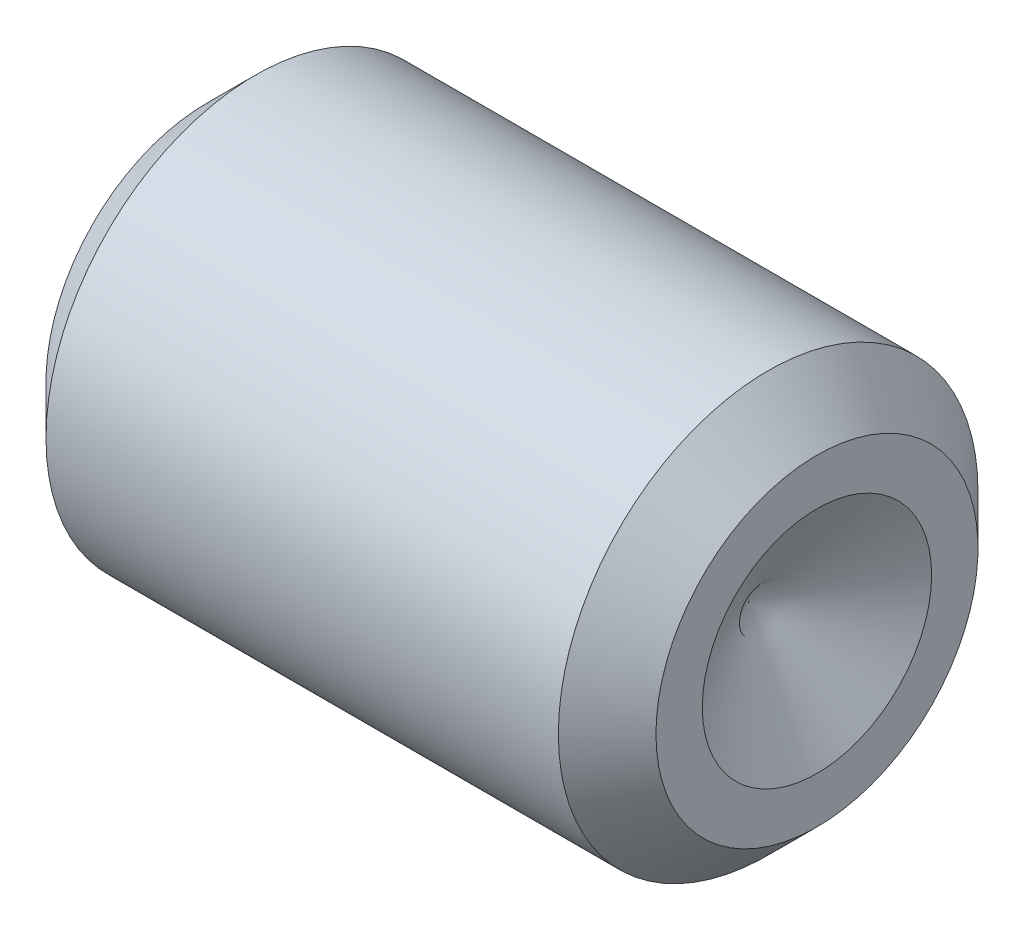
ISO-10303-21;
HEADER;
FILE_DESCRIPTION(('STEP AP214'),'2;1');
FILE_NAME('part.step','',(''),(''),'','','');
FILE_SCHEMA(('AUTOMOTIVE_DESIGN { 1 0 10303 214 1 1 1 1 }'));
ENDSEC;
DATA;
#1=APPLICATION_CONTEXT('core data for automotive mechanical design processes');
#2=APPLICATION_PROTOCOL_DEFINITION('international standard','automotive_design',2000,#1);
#3=PRODUCT_CONTEXT('',#1,'mechanical');
#4=PRODUCT('Part','Part','',(#3));
#5=PRODUCT_RELATED_PRODUCT_CATEGORY('part','',(#4));
#6=PRODUCT_DEFINITION_FORMATION('','',#4);
#7=PRODUCT_DEFINITION_CONTEXT('part definition',#1,'design');
#8=PRODUCT_DEFINITION('design','',#6,#7);
#9=PRODUCT_DEFINITION_SHAPE('','',#8);
#10=(LENGTH_UNIT() NAMED_UNIT(*) SI_UNIT(.MILLI.,.METRE.));
#11=(NAMED_UNIT(*) PLANE_ANGLE_UNIT() SI_UNIT($,.RADIAN.));
#12=(NAMED_UNIT(*) SI_UNIT($,.STERADIAN.) SOLID_ANGLE_UNIT());
#13=UNCERTAINTY_MEASURE_WITH_UNIT(LENGTH_MEASURE(1.E-05),#10,'distance_accuracy_value','');
#14=(GEOMETRIC_REPRESENTATION_CONTEXT(3) GLOBAL_UNCERTAINTY_ASSIGNED_CONTEXT((#13)) GLOBAL_UNIT_ASSIGNED_CONTEXT((#10,
#11,#12)) REPRESENTATION_CONTEXT('',''));
#15=CARTESIAN_POINT('',(0.,0.,0.));
#16=DIRECTION('',(0.,0.,1.));
#17=DIRECTION('',(1.,0.,0.));
#18=AXIS2_PLACEMENT_3D('',#15,#16,#17);
#19=CARTESIAN_POINT('',(0.558800000078463,0.,0.));
#20=DIRECTION('',(-1.,0.,0.));
#21=DIRECTION('',(0.,0.,1.));
#22=AXIS2_PLACEMENT_3D('',#19,#20,#21);
#23=CONICAL_SURFACE('',#22,0.457199999857494,1.06369782164251);
#24=CARTESIAN_POINT('',(0.558799999983724,0.,0.));
#25=DIRECTION('',(-1.,0.,0.));
#26=DIRECTION('',(0.,0.,1.));
#27=AXIS2_PLACEMENT_3D('',#24,#25,#26);
#28=CIRCLE('',#27,0.457200000028024);
#29=CARTESIAN_POINT('',(0.558799999991862,-0.228600000007006,-0.395946814622381));
#30=VERTEX_POINT('',#29);
#31=CARTESIAN_POINT('',(0.558799999991862,-0.457200000014012,0.));
#32=VERTEX_POINT('',#31);
#33=EDGE_CURVE('E368',#30,#32,#28,.T.);
#34=ORIENTED_EDGE('',*,*,#33,.T.);
#35=CARTESIAN_POINT('',(0.558799999983724,0.,0.));
#36=DIRECTION('',(-1.,0.,0.));
#37=DIRECTION('',(0.,0.,1.));
#38=AXIS2_PLACEMENT_3D('',#35,#36,#37);
#39=CIRCLE('',#38,0.457200000028024);
#40=CARTESIAN_POINT('',(0.558799999991862,-0.228600000007006,0.39594681462238));
#41=VERTEX_POINT('',#40);
#42=EDGE_CURVE('E371',#32,#41,#39,.T.);
#43=ORIENTED_EDGE('',*,*,#42,.T.);
#44=CARTESIAN_POINT('',(0.558799999983724,0.,0.));
#45=DIRECTION('',(-1.,0.,0.));
#46=DIRECTION('',(0.,0.,1.));
#47=AXIS2_PLACEMENT_3D('',#44,#45,#46);
#48=CIRCLE('',#47,0.457200000028024);
#49=CARTESIAN_POINT('',(0.558799999991862,0.228600000007006,0.395946814622381));
#50=VERTEX_POINT('',#49);
#51=EDGE_CURVE('E77',#41,#50,#48,.T.);
#52=ORIENTED_EDGE('',*,*,#51,.T.);
#53=CARTESIAN_POINT('',(0.558799999983724,0.,0.));
#54=DIRECTION('',(-1.,0.,0.));
#55=DIRECTION('',(0.,0.,1.));
#56=AXIS2_PLACEMENT_3D('',#53,#54,#55);
#57=CIRCLE('',#56,0.457200000028024);
#58=CARTESIAN_POINT('',(0.558799999991862,0.457200000014012,0.));
#59=VERTEX_POINT('',#58);
#60=EDGE_CURVE('E19',#50,#59,#57,.T.);
#61=ORIENTED_EDGE('',*,*,#60,.T.);
#62=CARTESIAN_POINT('',(0.558799999983724,0.,0.));
#63=DIRECTION('',(-1.,0.,0.));
#64=DIRECTION('',(0.,0.,1.));
#65=AXIS2_PLACEMENT_3D('',#62,#63,#64);
#66=CIRCLE('',#65,0.457200000028024);
#67=CARTESIAN_POINT('',(0.558799999991862,0.228600000007006,-0.39594681462238));
#68=VERTEX_POINT('',#67);
#69=EDGE_CURVE('E357',#59,#68,#66,.T.);
#70=ORIENTED_EDGE('',*,*,#69,.T.);
#71=CARTESIAN_POINT('',(0.558799999983724,0.,0.));
#72=DIRECTION('',(-1.,0.,0.));
#73=DIRECTION('',(0.,0.,1.));
#74=AXIS2_PLACEMENT_3D('',#71,#72,#73);
#75=CIRCLE('',#74,0.457200000028024);
#76=EDGE_CURVE('E311',#68,#30,#75,.T.);
#77=ORIENTED_EDGE('',*,*,#76,.T.);
#78=EDGE_LOOP('',(#34,#43,#52,#61,#70,#77));
#79=FACE_BOUND('',#78,.T.);
#80=CARTESIAN_POINT('',(0.812800000232983,3.97903932025656E-10,0.));
#81=VERTEX_POINT('',#80);
#82=VERTEX_LOOP('',#81);
#83=FACE_BOUND('',#82,.T.);
#84=ADVANCED_FACE('F16',(#79,#83),#23,.F.);
#85=CARTESIAN_POINT('',(0.5588,0.,0.));
#86=DIRECTION('',(1.,0.,0.));
#87=DIRECTION('',(0.,0.,-1.));
#88=AXIS2_PLACEMENT_3D('',#85,#86,#87);
#89=PLANE('',#88);
#90=DIRECTION('',(0.,-0.866025403784439,0.5));
#91=VECTOR('',#90,1.);
#92=CARTESIAN_POINT('',(0.5588,0.4572,0.263964543073498));
#93=LINE('',#92,#91);
#94=CARTESIAN_POINT('',(0.5588,0.4572,0.263964543073498));
#95=VERTEX_POINT('',#94);
#96=EDGE_CURVE('E248',#50,#95,#93,.F.);
#97=ORIENTED_EDGE('',*,*,#96,.T.);
#98=DIRECTION('',(0.,0.,1.));
#99=VECTOR('',#98,1.);
#100=CARTESIAN_POINT('',(0.5588,0.4572,0.));
#101=LINE('',#100,#99);
#102=EDGE_CURVE('E288',#95,#59,#101,.F.);
#103=ORIENTED_EDGE('',*,*,#102,.T.);
#104=ORIENTED_EDGE('',*,*,#60,.F.);
#105=EDGE_LOOP('',(#97,#103,#104));
#106=FACE_BOUND('',#105,.T.);
#107=ADVANCED_FACE('F85',(#106),#89,.F.);
#108=CARTESIAN_POINT('',(0.5588,0.,0.));
#109=DIRECTION('',(1.,0.,0.));
#110=DIRECTION('',(0.,0.,-1.));
#111=AXIS2_PLACEMENT_3D('',#108,#109,#110);
#112=PLANE('',#111);
#113=DIRECTION('',(0.,-0.866025403784439,-0.5));
#114=VECTOR('',#113,1.);
#115=CARTESIAN_POINT('',(0.5588,0.,0.527929086146993));
#116=LINE('',#115,#114);
#117=CARTESIAN_POINT('',(0.5588,0.,0.527929086146993));
#118=VERTEX_POINT('',#117);
#119=EDGE_CURVE('E235',#41,#118,#116,.F.);
#120=ORIENTED_EDGE('',*,*,#119,.T.);
#121=DIRECTION('',(0.,-0.866025403784439,0.5));
#122=VECTOR('',#121,1.);
#123=CARTESIAN_POINT('',(0.5588,0.4572,0.263964543073498));
#124=LINE('',#123,#122);
#125=EDGE_CURVE('E237',#118,#50,#124,.F.);
#126=ORIENTED_EDGE('',*,*,#125,.T.);
#127=ORIENTED_EDGE('',*,*,#51,.F.);
#128=EDGE_LOOP('',(#120,#126,#127));
#129=FACE_BOUND('',#128,.T.);
#130=ADVANCED_FACE('F90',(#129),#112,.F.);
#131=CARTESIAN_POINT('',(0.5588,0.,0.));
#132=DIRECTION('',(1.,0.,0.));
#133=DIRECTION('',(0.,0.,-1.));
#134=AXIS2_PLACEMENT_3D('',#131,#132,#133);
#135=PLANE('',#134);
#136=DIRECTION('',(0.,0.,-1.));
#137=VECTOR('',#136,1.);
#138=CARTESIAN_POINT('',(0.5588,-0.4572,0.263964543073498));
#139=LINE('',#138,#137);
#140=CARTESIAN_POINT('',(0.5588,-0.4572,0.263964543073497));
#141=VERTEX_POINT('',#140);
#142=EDGE_CURVE('E256',#32,#141,#139,.F.);
#143=ORIENTED_EDGE('',*,*,#142,.T.);
#144=DIRECTION('',(0.,-0.866025403784439,-0.5));
#145=VECTOR('',#144,1.);
#146=CARTESIAN_POINT('',(0.5588,0.,0.527929086146993));
#147=LINE('',#146,#145);
#148=EDGE_CURVE('E243',#141,#41,#147,.F.);
#149=ORIENTED_EDGE('',*,*,#148,.T.);
#150=ORIENTED_EDGE('',*,*,#42,.F.);
#151=EDGE_LOOP('',(#143,#149,#150));
#152=FACE_BOUND('',#151,.T.);
#153=ADVANCED_FACE('F224',(#152),#135,.F.);
#154=CARTESIAN_POINT('',(0.5588,0.,0.));
#155=DIRECTION('',(1.,0.,0.));
#156=DIRECTION('',(0.,0.,-1.));
#157=AXIS2_PLACEMENT_3D('',#154,#155,#156);
#158=PLANE('',#157);
#159=DIRECTION('',(0.,0.866025403784438,-0.5));
#160=VECTOR('',#159,1.);
#161=CARTESIAN_POINT('',(0.5588,-0.4572,-0.263964543073498));
#162=LINE('',#161,#160);
#163=CARTESIAN_POINT('',(0.5588,-0.4572,-0.263964543073498));
#164=VERTEX_POINT('',#163);
#165=EDGE_CURVE('E271',#30,#164,#162,.F.);
#166=ORIENTED_EDGE('',*,*,#165,.T.);
#167=DIRECTION('',(0.,0.,-1.));
#168=VECTOR('',#167,1.);
#169=CARTESIAN_POINT('',(0.5588,-0.4572,0.263964543073498));
#170=LINE('',#169,#168);
#171=EDGE_CURVE('E253',#164,#32,#170,.F.);
#172=ORIENTED_EDGE('',*,*,#171,.T.);
#173=ORIENTED_EDGE('',*,*,#33,.F.);
#174=EDGE_LOOP('',(#166,#172,#173));
#175=FACE_BOUND('',#174,.T.);
#176=ADVANCED_FACE('F220',(#175),#158,.F.);
#177=CARTESIAN_POINT('',(0.5588,0.,0.));
#178=DIRECTION('',(1.,0.,0.));
#179=DIRECTION('',(0.,0.,-1.));
#180=AXIS2_PLACEMENT_3D('',#177,#178,#179);
#181=PLANE('',#180);
#182=DIRECTION('',(0.,0.,1.));
#183=VECTOR('',#182,1.);
#184=CARTESIAN_POINT('',(0.5588,0.4572,0.));
#185=LINE('',#184,#183);
#186=CARTESIAN_POINT('',(0.5588,0.457199999999999,-0.263964543073497));
#187=VERTEX_POINT('',#186);
#188=EDGE_CURVE('E249',#59,#187,#185,.F.);
#189=ORIENTED_EDGE('',*,*,#188,.T.);
#190=DIRECTION('',(0.,0.866025403784439,0.499999999999999));
#191=VECTOR('',#190,1.);
#192=CARTESIAN_POINT('',(0.5588,0.,-0.527929086146993));
#193=LINE('',#192,#191);
#194=EDGE_CURVE('E278',#187,#68,#193,.F.);
#195=ORIENTED_EDGE('',*,*,#194,.T.);
#196=ORIENTED_EDGE('',*,*,#69,.F.);
#197=EDGE_LOOP('',(#189,#195,#196));
#198=FACE_BOUND('',#197,.T.);
#199=ADVANCED_FACE('F216',(#198),#181,.F.);
#200=CARTESIAN_POINT('',(0.5588,0.,0.));
#201=DIRECTION('',(1.,0.,0.));
#202=DIRECTION('',(0.,0.,-1.));
#203=AXIS2_PLACEMENT_3D('',#200,#201,#202);
#204=PLANE('',#203);
#205=DIRECTION('',(0.,0.866025403784439,0.499999999999999));
#206=VECTOR('',#205,1.);
#207=CARTESIAN_POINT('',(0.5588,0.,-0.527929086146993));
#208=LINE('',#207,#206);
#209=CARTESIAN_POINT('',(0.5588,0.,-0.527929086146994));
#210=VERTEX_POINT('',#209);
#211=EDGE_CURVE('E275',#68,#210,#208,.F.);
#212=ORIENTED_EDGE('',*,*,#211,.T.);
#213=DIRECTION('',(0.,0.866025403784438,-0.5));
#214=VECTOR('',#213,1.);
#215=CARTESIAN_POINT('',(0.5588,-0.4572,-0.263964543073498));
#216=LINE('',#215,#214);
#217=EDGE_CURVE('E268',#210,#30,#216,.F.);
#218=ORIENTED_EDGE('',*,*,#217,.T.);
#219=ORIENTED_EDGE('',*,*,#76,.F.);
#220=EDGE_LOOP('',(#212,#218,#219));
#221=FACE_BOUND('',#220,.T.);
#222=ADVANCED_FACE('F212',(#221),#204,.F.);
#223=CARTESIAN_POINT('',(0.,0.4572,0.));
#224=DIRECTION('',(0.,1.,0.));
#225=DIRECTION('',(0.,0.,1.));
#226=AXIS2_PLACEMENT_3D('',#223,#224,#225);
#227=PLANE('',#226);
#228=DIRECTION('',(1.,0.,0.));
#229=VECTOR('',#228,1.);
#230=CARTESIAN_POINT('',(0.,0.457199999999999,-0.263964543073497));
#231=LINE('',#230,#229);
#232=CARTESIAN_POINT('',(-4.50193157804643E-11,0.457200000010678,-0.263964543067331));
#233=VERTEX_POINT('',#232);
#234=EDGE_CURVE('E283',#233,#187,#231,.T.);
#235=ORIENTED_EDGE('',*,*,#234,.T.);
#236=ORIENTED_EDGE('',*,*,#188,.F.);
#237=ORIENTED_EDGE('',*,*,#102,.F.);
#238=DIRECTION('',(1.,0.,0.));
#239=VECTOR('',#238,1.);
#240=CARTESIAN_POINT('',(0.,0.4572,0.263964543073498));
#241=LINE('',#240,#239);
#242=CARTESIAN_POINT('',(-4.50196888003958E-11,0.457200000004683,0.263964543077716));
#243=VERTEX_POINT('',#242);
#244=EDGE_CURVE('E264',#95,#243,#241,.F.);
#245=ORIENTED_EDGE('',*,*,#244,.T.);
#246=CARTESIAN_POINT('',(-3.31961176484604E-11,0.4572,0.263964543070468));
#247=CARTESIAN_POINT('',(0.00866969135222407,0.4572,0.252690640052658));
#248=CARTESIAN_POINT('',(0.0170852653293036,0.4572,0.241228193482879));
#249=CARTESIAN_POINT('',(0.0332785253478044,0.4572,0.217792776886532));
#250=CARTESIAN_POINT('',(0.0410534104734048,0.4572,0.205817880470274));
#251=CARTESIAN_POINT('',(0.0633990017934871,0.4572,0.168591746678174));
#252=CARTESIAN_POINT('',(0.0766401861856192,0.4572,0.142470106101399));
#253=CARTESIAN_POINT('',(0.093286818354674,0.4572,0.098196341002111));
#254=CARTESIAN_POINT('',(0.098518479824682,0.4572,0.0807441477115535));
#255=CARTESIAN_POINT('',(0.105954087933421,0.4572,0.0453223932737816));
#256=CARTESIAN_POINT('',(0.108181992192743,0.4572,0.0273581071586558));
#257=CARTESIAN_POINT('',(0.109316971274068,0.4572,-0.00879249492802968));
#258=CARTESIAN_POINT('',(0.10820324236577,0.4572,-0.0269794968828948));
#259=CARTESIAN_POINT('',(0.102798619563419,0.4572,-0.0629182867727759));
#260=CARTESIAN_POINT('',(0.098496159029847,0.4572,-0.0806682465996506));
#261=CARTESIAN_POINT('',(0.0849441947114099,0.4572,-0.122681972814352));
#262=CARTESIAN_POINT('',(0.074369016884494,0.4572,-0.146505940115235));
#263=CARTESIAN_POINT('',(0.0498772781024926,0.4572,-0.192323617383599));
#264=CARTESIAN_POINT('',(0.0359535287323341,0.4572,-0.214313250894164));
#265=CARTESIAN_POINT('',(0.0141795759222059,0.4572,-0.245167447196996));
#266=CARTESIAN_POINT('',(0.00717030836528534,0.4572,-0.254635442548347));
#267=CARTESIAN_POINT('',(-3.31892035022744E-11,0.4572,-0.263964543070473));
#268=B_SPLINE_CURVE_WITH_KNOTS('',3,(#246,#247,#248,#249,#250,#251,#252,#253,#254,#255,#256,
#257,#258,#259,#260,#261,#262,#263,#264,#265,#266,#267),.UNSPECIFIED.,.F.,.F.,(4,2,2,2,2,2,2,2,
2,2,4),(0.,0.0426460665862241,0.0854696411377669,0.172774225272181,0.227226156595512,
0.28124116423292,0.335593144952169,0.390143250135273,0.467890379854586,0.545805923852626,
0.581126735802738),.UNSPECIFIED.);
#269=EDGE_CURVE('E197',#243,#233,#268,.T.);
#270=ORIENTED_EDGE('',*,*,#269,.T.);
#271=EDGE_LOOP('',(#235,#236,#237,#245,#270));
#272=FACE_BOUND('',#271,.T.);
#273=ADVANCED_FACE('F207',(#272),#227,.F.);
#274=CARTESIAN_POINT('',(0.,0.4572,0.263964543073498));
#275=DIRECTION('',(0.,0.5,0.866025403784439));
#276=DIRECTION('',(0.,-0.866025403784439,0.5));
#277=AXIS2_PLACEMENT_3D('',#274,#275,#276);
#278=PLANE('',#277);
#279=ORIENTED_EDGE('',*,*,#244,.F.);
#280=ORIENTED_EDGE('',*,*,#96,.F.);
#281=ORIENTED_EDGE('',*,*,#125,.F.);
#282=DIRECTION('',(1.,0.,0.));
#283=VECTOR('',#282,1.);
#284=CARTESIAN_POINT('',(0.,0.,0.527929086146993));
#285=LINE('',#284,#283);
#286=CARTESIAN_POINT('',(-4.50192538949564E-11,-1.31146766341883E-12,0.527929086153159));
#287=VERTEX_POINT('',#286);
#288=EDGE_CURVE('E242',#118,#287,#285,.F.);
#289=ORIENTED_EDGE('',*,*,#288,.T.);
#290=CARTESIAN_POINT('',(-3.31961182216167E-11,2.62435454385986E-12,0.527929086145479));
#291=CARTESIAN_POINT('',(0.00866969135222403,0.00976348641585029,0.522292134636574));
#292=CARTESIAN_POINT('',(0.0170852653293035,0.0196902563348002,0.516560911351685));
#293=CARTESIAN_POINT('',(0.0332785253478043,0.039985922455508,0.504843203053512));
#294=CARTESIAN_POINT('',(0.0410534104734048,0.0503564869596744,0.498855754845383));
#295=CARTESIAN_POINT('',(0.0633990017934871,0.0825952645083118,0.480242687949332));
#296=CARTESIAN_POINT('',(0.076640186185619,0.105217268836325,0.467181867660945));
#297=CARTESIAN_POINT('',(0.0932868183546734,0.143559474133494,0.445044985111301));
#298=CARTESIAN_POINT('',(0.0985184798246813,0.158673516874873,0.436318888466022));
#299=CARTESIAN_POINT('',(0.10595408793342,0.189349656064598,0.418608011247136));
#300=CARTESIAN_POINT('',(0.108181992192742,0.204907184201149,0.409625868189573));
#301=CARTESIAN_POINT('',(0.109316971274066,0.236214523970321,0.39155056714623));
#302=CARTESIAN_POINT('',(0.108203242365768,0.251964929681912,0.382457066168798));
#303=CARTESIAN_POINT('',(0.102798619563418,0.28308883470782,0.364487671223857));
#304=CARTESIAN_POINT('',(0.0984961590298454,0.298460750834047,0.35561269131042));
#305=CARTESIAN_POINT('',(0.0849441947114081,0.334845705043623,0.334605828203069));
#306=CARTESIAN_POINT('',(0.0743690168844919,0.355477865945117,0.322693844552628));
#307=CARTESIAN_POINT('',(0.0498772781024901,0.395157138401917,0.299785005918445));
#308=CARTESIAN_POINT('',(0.0359535287323314,0.414200719641976,0.288790189163163));
#309=CARTESIAN_POINT('',(0.0141795759222038,0.44092123745358,0.273363091011747));
#310=CARTESIAN_POINT('',(0.00717030836528414,0.449120761950762,0.268629093336073));
#311=CARTESIAN_POINT('',(-3.31895056298121E-11,0.45719999999738,0.26396454307501));
#312=B_SPLINE_CURVE_WITH_KNOTS('',3,(#290,#291,#292,#293,#294,#295,#296,#297,#298,#299,#300,
#301,#302,#303,#304,#305,#306,#307,#308,#309,#310,#311),.UNSPECIFIED.,.F.,.F.,(4,2,2,2,2,2,2,2,
2,2,4),(0.,0.0426460665862241,0.085469641137767,0.172774225272181,0.227226156595512,
0.28124116423292,0.335593144952169,0.390143250135273,0.467890379854587,0.545805923852627,
0.581126735802735),.UNSPECIFIED.);
#313=EDGE_CURVE('E190',#287,#243,#312,.T.);
#314=ORIENTED_EDGE('',*,*,#313,.T.);
#315=EDGE_LOOP('',(#279,#280,#281,#289,#314));
#316=FACE_BOUND('',#315,.T.);
#317=ADVANCED_FACE('F204',(#316),#278,.F.);
#318=CARTESIAN_POINT('',(0.,0.,0.527929086146993));
#319=DIRECTION('',(0.,-0.5,0.866025403784439));
#320=DIRECTION('',(0.,-0.866025403784439,-0.5));
#321=AXIS2_PLACEMENT_3D('',#318,#319,#320);
#322=PLANE('',#321);
#323=ORIENTED_EDGE('',*,*,#288,.F.);
#324=ORIENTED_EDGE('',*,*,#119,.F.);
#325=ORIENTED_EDGE('',*,*,#148,.F.);
#326=DIRECTION('',(1.,0.,0.));
#327=VECTOR('',#326,1.);
#328=CARTESIAN_POINT('',(0.,-0.4572,0.263964543073498));
#329=LINE('',#328,#327);
#330=CARTESIAN_POINT('',(-4.50192157633293E-11,-0.457200000004683,0.263964543077715));
#331=VERTEX_POINT('',#330);
#332=EDGE_CURVE('E272',#141,#331,#329,.F.);
#333=ORIENTED_EDGE('',*,*,#332,.T.);
#334=CARTESIAN_POINT('',(-3.31950538025962E-11,-0.457199999997376,0.263964543075011));
#335=CARTESIAN_POINT('',(0.00866969135222508,-0.44743651358415,0.269601494583916));
#336=CARTESIAN_POINT('',(0.0170852653293046,-0.437509743665201,0.275332717868805));
#337=CARTESIAN_POINT('',(0.0332785253478054,-0.417214077544493,0.287050426166979));
#338=CARTESIAN_POINT('',(0.0410534104734058,-0.406843513040326,0.293037874375108));
#339=CARTESIAN_POINT('',(0.0633990017934883,-0.374604735491689,0.311650941271158));
#340=CARTESIAN_POINT('',(0.0766401861856202,-0.351982731163676,0.324711761559545));
#341=CARTESIAN_POINT('',(0.093286818354675,-0.313640525866507,0.346848644109189));
#342=CARTESIAN_POINT('',(0.098518479824683,-0.298526483125128,0.355574740754468));
#343=CARTESIAN_POINT('',(0.105954087933422,-0.267850343935404,0.373285617973354));
#344=CARTESIAN_POINT('',(0.108181992192744,-0.252292815798853,0.382267761030917));
#345=CARTESIAN_POINT('',(0.109316971274069,-0.22098547602968,0.40034306207426));
#346=CARTESIAN_POINT('',(0.108203242365771,-0.20523507031809,0.409436563051692));
#347=CARTESIAN_POINT('',(0.10279861956342,-0.174111165292181,0.427405957996633));
#348=CARTESIAN_POINT('',(0.0984961590298478,-0.158739249165955,0.43628093791007));
#349=CARTESIAN_POINT('',(0.0849441947114107,-0.122354294956379,0.457287801017421));
#350=CARTESIAN_POINT('',(0.0743690168844947,-0.101722134054885,0.469199784667862));
#351=CARTESIAN_POINT('',(0.0498772781024934,-0.0620428615980845,0.492108623302044));
#352=CARTESIAN_POINT('',(0.0359535287323348,-0.042999280358026,0.503103440057326));
#353=CARTESIAN_POINT('',(0.0141795759222066,-0.0162787625464212,0.518530538208743));
#354=CARTESIAN_POINT('',(0.00717030836528601,-0.00807923804923822,0.523264535884418));
#355=CARTESIAN_POINT('',(-3.31886207193341E-11,-2.6188449761359E-12,0.527929086145481));
#356=B_SPLINE_CURVE_WITH_KNOTS('',3,(#334,#335,#336,#337,#338,#339,#340,#341,#342,#343,#344,
#345,#346,#347,#348,#349,#350,#351,#352,#353,#354,#355),.UNSPECIFIED.,.F.,.F.,(4,2,2,2,2,2,2,2,
2,2,4),(0.,0.042646066586224,0.0854696411377667,0.172774225272181,0.227226156595511,
0.28124116423292,0.335593144952169,0.390143250135273,0.467890379854585,0.545805923852625,
0.581126735802738),.UNSPECIFIED.);
#357=EDGE_CURVE('E168',#331,#287,#356,.T.);
#358=ORIENTED_EDGE('',*,*,#357,.T.);
#359=EDGE_LOOP('',(#323,#324,#325,#333,#358));
#360=FACE_BOUND('',#359,.T.);
#361=ADVANCED_FACE('F157',(#360),#322,.F.);
#362=CARTESIAN_POINT('',(0.,-0.4572,0.263964543073498));
#363=DIRECTION('',(0.,-1.,0.));
#364=DIRECTION('',(0.,0.,-1.));
#365=AXIS2_PLACEMENT_3D('',#362,#363,#364);
#366=PLANE('',#365);
#367=ORIENTED_EDGE('',*,*,#332,.F.);
#368=ORIENTED_EDGE('',*,*,#142,.F.);
#369=ORIENTED_EDGE('',*,*,#171,.F.);
#370=DIRECTION('',(1.,0.,0.));
#371=VECTOR('',#370,1.);
#372=CARTESIAN_POINT('',(0.,-0.4572,-0.263964543073498));
#373=LINE('',#372,#371);
#374=CARTESIAN_POINT('',(-4.50197205617373E-11,-0.457200000004683,-0.263964543077716));
#375=VERTEX_POINT('',#374);
#376=EDGE_CURVE('E295',#164,#375,#373,.F.);
#377=ORIENTED_EDGE('',*,*,#376,.T.);
#378=CARTESIAN_POINT('',(-3.31960055575737E-11,-0.4572,-0.263964543070468));
#379=CARTESIAN_POINT('',(0.00866969135222419,-0.4572,-0.252690640052658));
#380=CARTESIAN_POINT('',(0.0170852653293037,-0.4572,-0.241228193482879));
#381=CARTESIAN_POINT('',(0.0332785253478045,-0.4572,-0.217792776886532));
#382=CARTESIAN_POINT('',(0.0410534104734049,-0.4572,-0.205817880470275));
#383=CARTESIAN_POINT('',(0.0633990017934872,-0.4572,-0.168591746678174));
#384=CARTESIAN_POINT('',(0.0766401861856193,-0.4572,-0.142470106101399));
#385=CARTESIAN_POINT('',(0.0932868183546741,-0.4572,-0.0981963410021112));
#386=CARTESIAN_POINT('',(0.0985184798246821,-0.4572,-0.0807441477115537));
#387=CARTESIAN_POINT('',(0.105954087933421,-0.4572,-0.0453223932737818));
#388=CARTESIAN_POINT('',(0.108181992192743,-0.4572,-0.0273581071586559));
#389=CARTESIAN_POINT('',(0.109316971274068,-0.4572,0.00879249492802957));
#390=CARTESIAN_POINT('',(0.10820324236577,-0.4572,0.0269794968828947));
#391=CARTESIAN_POINT('',(0.102798619563419,-0.4572,0.0629182867727758));
#392=CARTESIAN_POINT('',(0.098496159029847,-0.4572,0.0806682465996504));
#393=CARTESIAN_POINT('',(0.0849441947114098,-0.4572,0.122681972814352));
#394=CARTESIAN_POINT('',(0.0743690168844938,-0.4572,0.146505940115235));
#395=CARTESIAN_POINT('',(0.0498772781024923,-0.4572,0.192323617383599));
#396=CARTESIAN_POINT('',(0.0359535287323337,-0.4572,0.214313250894164));
#397=CARTESIAN_POINT('',(0.0141795759222056,-0.4572,0.245167447196996));
#398=CARTESIAN_POINT('',(0.0071703083652851,-0.4572,0.254635442548347));
#399=CARTESIAN_POINT('',(-3.31893871226702E-11,-0.4572,0.263964543070473));
#400=B_SPLINE_CURVE_WITH_KNOTS('',3,(#378,#379,#380,#381,#382,#383,#384,#385,#386,#387,#388,
#389,#390,#391,#392,#393,#394,#395,#396,#397,#398,#399),.UNSPECIFIED.,.F.,.F.,(4,2,2,2,2,2,2,2,
2,2,4),(0.,0.0426460665862241,0.0854696411377669,0.172774225272181,0.227226156595511,
0.28124116423292,0.335593144952169,0.390143250135273,0.467890379854586,0.545805923852626,
0.581126735802738),.UNSPECIFIED.);
#401=EDGE_CURVE('E161',#375,#331,#400,.T.);
#402=ORIENTED_EDGE('',*,*,#401,.T.);
#403=EDGE_LOOP('',(#367,#368,#369,#377,#402));
#404=FACE_BOUND('',#403,.T.);
#405=ADVANCED_FACE('F153',(#404),#366,.F.);
#406=CARTESIAN_POINT('',(0.,-0.4572,-0.263964543073498));
#407=DIRECTION('',(0.,-0.5,-0.866025403784438));
#408=DIRECTION('',(0.,0.866025403784438,-0.5));
#409=AXIS2_PLACEMENT_3D('',#406,#407,#408);
#410=PLANE('',#409);
#411=ORIENTED_EDGE('',*,*,#376,.F.);
#412=ORIENTED_EDGE('',*,*,#165,.F.);
#413=ORIENTED_EDGE('',*,*,#217,.F.);
#414=DIRECTION('',(1.,0.,0.));
#415=VECTOR('',#414,1.);
#416=CARTESIAN_POINT('',(0.,0.,-0.527929086146993));
#417=LINE('',#416,#415);
#418=CARTESIAN_POINT('',(-4.50192449529406E-11,1.31135445861731E-12,-0.527929086153159));
#419=VERTEX_POINT('',#418);
#420=EDGE_CURVE('E34',#210,#419,#417,.F.);
#421=ORIENTED_EDGE('',*,*,#420,.T.);
#422=CARTESIAN_POINT('',(-3.31963364972811E-11,-2.62464438067138E-12,-0.52792908614548));
#423=CARTESIAN_POINT('',(0.00866969135222376,-0.0097634864158506,-0.522292134636574));
#424=CARTESIAN_POINT('',(0.0170852653293032,-0.0196902563348005,-0.516560911351685));
#425=CARTESIAN_POINT('',(0.033278525347804,-0.0399859224555083,-0.504843203053512));
#426=CARTESIAN_POINT('',(0.0410534104734044,-0.0503564869596748,-0.498855754845383));
#427=CARTESIAN_POINT('',(0.0633990017934867,-0.0825952645083121,-0.480242687949332));
#428=CARTESIAN_POINT('',(0.0766401861856186,-0.105217268836326,-0.467181867660945));
#429=CARTESIAN_POINT('',(0.0932868183546732,-0.143559474133494,-0.445044985111301));
#430=CARTESIAN_POINT('',(0.0985184798246812,-0.158673516874873,-0.436318888466022));
#431=CARTESIAN_POINT('',(0.10595408793342,-0.189349656064598,-0.418608011247136));
#432=CARTESIAN_POINT('',(0.108181992192742,-0.204907184201149,-0.409625868189573));
#433=CARTESIAN_POINT('',(0.109316971274066,-0.236214523970321,-0.39155056714623));
#434=CARTESIAN_POINT('',(0.108203242365768,-0.251964929681912,-0.382457066168798));
#435=CARTESIAN_POINT('',(0.102798619563417,-0.28308883470782,-0.364487671223857));
#436=CARTESIAN_POINT('',(0.0984961590298452,-0.298460750834047,-0.35561269131042));
#437=CARTESIAN_POINT('',(0.0849441947114078,-0.334845705043623,-0.334605828203069));
#438=CARTESIAN_POINT('',(0.0743690168844917,-0.355477865945117,-0.322693844552627));
#439=CARTESIAN_POINT('',(0.0498772781024898,-0.395157138401918,-0.299785005918445));
#440=CARTESIAN_POINT('',(0.035953528732331,-0.414200719641976,-0.288790189163163));
#441=CARTESIAN_POINT('',(0.0141795759222036,-0.44092123745358,-0.273363091011747));
#442=CARTESIAN_POINT('',(0.00717030836528406,-0.449120761950762,-0.268629093336072));
#443=CARTESIAN_POINT('',(-3.31894307677437E-11,-0.45719999999738,-0.26396454307501));
#444=B_SPLINE_CURVE_WITH_KNOTS('',3,(#422,#423,#424,#425,#426,#427,#428,#429,#430,#431,#432,
#433,#434,#435,#436,#437,#438,#439,#440,#441,#442,#443),.UNSPECIFIED.,.F.,.F.,(4,2,2,2,2,2,2,2,
2,2,4),(0.,0.0426460665862241,0.0854696411377669,0.172774225272181,0.227226156595512,
0.28124116423292,0.335593144952169,0.390143250135273,0.467890379854587,0.545805923852627,
0.581126735802735),.UNSPECIFIED.);
#445=EDGE_CURVE('E134',#419,#375,#444,.T.);
#446=ORIENTED_EDGE('',*,*,#445,.T.);
#447=EDGE_LOOP('',(#411,#412,#413,#421,#446));
#448=FACE_BOUND('',#447,.T.);
#449=ADVANCED_FACE('F147',(#448),#410,.F.);
#450=CARTESIAN_POINT('',(0.,0.,-0.527929086146993));
#451=DIRECTION('',(0.,0.499999999999999,-0.866025403784439));
#452=DIRECTION('',(0.,0.866025403784439,0.499999999999999));
#453=AXIS2_PLACEMENT_3D('',#450,#451,#452);
#454=PLANE('',#453);
#455=ORIENTED_EDGE('',*,*,#420,.F.);
#456=ORIENTED_EDGE('',*,*,#211,.F.);
#457=ORIENTED_EDGE('',*,*,#194,.F.);
#458=ORIENTED_EDGE('',*,*,#234,.F.);
#459=CARTESIAN_POINT('',(-3.31952526441683E-11,0.457199999997376,-0.263964543075011));
#460=CARTESIAN_POINT('',(0.00866969135222485,0.44743651358415,-0.269601494583917));
#461=CARTESIAN_POINT('',(0.0170852653293043,0.4375097436652,-0.275332717868806));
#462=CARTESIAN_POINT('',(0.0332785253478052,0.417214077544493,-0.287050426166979));
#463=CARTESIAN_POINT('',(0.0410534104734056,0.406843513040326,-0.293037874375108));
#464=CARTESIAN_POINT('',(0.0633990017934881,0.374604735491689,-0.311650941271158));
#465=CARTESIAN_POINT('',(0.0766401861856201,0.351982731163676,-0.324711761559546));
#466=CARTESIAN_POINT('',(0.0932868183546748,0.313640525866507,-0.34684864410919));
#467=CARTESIAN_POINT('',(0.0985184798246828,0.298526483125128,-0.355574740754468));
#468=CARTESIAN_POINT('',(0.105954087933421,0.267850343935403,-0.373285617973354));
#469=CARTESIAN_POINT('',(0.108181992192744,0.252292815798852,-0.382267761030917));
#470=CARTESIAN_POINT('',(0.109316971274068,0.22098547602968,-0.40034306207426));
#471=CARTESIAN_POINT('',(0.10820324236577,0.205235070318089,-0.409436563051693));
#472=CARTESIAN_POINT('',(0.10279861956342,0.174111165292181,-0.427405957996633));
#473=CARTESIAN_POINT('',(0.0984961590298476,0.158739249165954,-0.43628093791007));
#474=CARTESIAN_POINT('',(0.0849441947114105,0.122354294956378,-0.457287801017421));
#475=CARTESIAN_POINT('',(0.0743690168844946,0.101722134054884,-0.469199784667862));
#476=CARTESIAN_POINT('',(0.0498772781024931,0.0620428615980841,-0.492108623302045));
#477=CARTESIAN_POINT('',(0.0359535287323346,0.0429992803580256,-0.503103440057327));
#478=CARTESIAN_POINT('',(0.0141795759222064,0.0162787625464208,-0.518530538208743));
#479=CARTESIAN_POINT('',(0.00717030836528592,0.00807923804923796,-0.523264535884418));
#480=CARTESIAN_POINT('',(-3.31885841300078E-11,2.61870426258074E-12,-0.527929086145481));
#481=B_SPLINE_CURVE_WITH_KNOTS('',3,(#459,#460,#461,#462,#463,#464,#465,#466,#467,#468,#469,
#470,#471,#472,#473,#474,#475,#476,#477,#478,#479,#480),.UNSPECIFIED.,.F.,.F.,(4,2,2,2,2,2,2,2,
2,2,4),(0.,0.042646066586224,0.0854696411377668,0.172774225272181,0.227226156595511,
0.28124116423292,0.335593144952169,0.390143250135273,0.467890379854586,0.545805923852626,
0.581126735802738),.UNSPECIFIED.);
#482=EDGE_CURVE('E125',#233,#419,#481,.T.);
#483=ORIENTED_EDGE('',*,*,#482,.T.);
#484=EDGE_LOOP('',(#455,#456,#457,#458,#483));
#485=FACE_BOUND('',#484,.T.);
#486=ADVANCED_FACE('F142',(#485),#454,.F.);
#487=CARTESIAN_POINT('',(3.17499999988513,0.,0.));
#488=DIRECTION('',(1.,0.,0.));
#489=DIRECTION('',(0.,0.,-1.));
#490=AXIS2_PLACEMENT_3D('',#487,#488,#489);
#491=CONICAL_SURFACE('',#490,0.59689999989132,1.03351161235804);
#492=CARTESIAN_POINT('',(3.17499999995286,0.,0.));
#493=DIRECTION('',(1.,0.,0.));
#494=DIRECTION('',(0.,0.,-1.));
#495=AXIS2_PLACEMENT_3D('',#492,#493,#494);
#496=CIRCLE('',#495,0.596900000005007);
#497=CARTESIAN_POINT('',(3.17499999995286,0.,-0.596900000005007));
#498=VERTEX_POINT('',#497);
#499=EDGE_CURVE('E133',#498,#498,#496,.F.);
#500=ORIENTED_EDGE('',*,*,#499,.F.);
#501=EDGE_LOOP('',(#500));
#502=FACE_BOUND('',#501,.T.);
#503=CARTESIAN_POINT('',(2.81939999990755,1.13686837721616E-10,0.));
#504=VERTEX_POINT('',#503);
#505=VERTEX_LOOP('',#504);
#506=FACE_BOUND('',#505,.T.);
#507=ADVANCED_FACE('F146',(#502,#506),#491,.F.);
#508=CARTESIAN_POINT('',(-5.6843418860808E-11,0.,0.));
#509=DIRECTION('',(-1.,0.,0.));
#510=DIRECTION('',(0.,0.,1.));
#511=AXIS2_PLACEMENT_3D('',#508,#509,#510);
#512=CONICAL_SURFACE('',#511,0.527929086160839,0.576037046549668);
#513=CARTESIAN_POINT('',(-5.6843418860808E-11,0.,0.));
#514=DIRECTION('',(-1.,0.,0.));
#515=DIRECTION('',(0.,0.,1.));
#516=AXIS2_PLACEMENT_3D('',#513,#514,#515);
#517=CIRCLE('',#516,0.527929086160839);
#518=EDGE_CURVE('E337',#233,#243,#517,.F.);
#519=ORIENTED_EDGE('',*,*,#518,.F.);
#520=ORIENTED_EDGE('',*,*,#269,.F.);
#521=EDGE_LOOP('',(#519,#520));
#522=FACE_BOUND('',#521,.T.);
#523=ADVANCED_FACE('F187',(#522),#512,.F.);
#524=CARTESIAN_POINT('',(-5.6843418860808E-11,0.,0.));
#525=DIRECTION('',(-1.,0.,0.));
#526=DIRECTION('',(0.,0.,1.));
#527=AXIS2_PLACEMENT_3D('',#524,#525,#526);
#528=CONICAL_SURFACE('',#527,0.527929086160839,0.576037046549668);
#529=CARTESIAN_POINT('',(-5.6843418860808E-11,0.,0.));
#530=DIRECTION('',(-1.,0.,0.));
#531=DIRECTION('',(0.,0.,1.));
#532=AXIS2_PLACEMENT_3D('',#529,#530,#531);
#533=CIRCLE('',#532,0.527929086160839);
#534=EDGE_CURVE('E335',#243,#287,#533,.F.);
#535=ORIENTED_EDGE('',*,*,#534,.F.);
#536=ORIENTED_EDGE('',*,*,#313,.F.);
#537=EDGE_LOOP('',(#535,#536));
#538=FACE_BOUND('',#537,.T.);
#539=ADVANCED_FACE('F183',(#538),#528,.F.);
#540=CARTESIAN_POINT('',(-5.6843418860808E-11,0.,0.));
#541=DIRECTION('',(-1.,0.,0.));
#542=DIRECTION('',(0.,0.,1.));
#543=AXIS2_PLACEMENT_3D('',#540,#541,#542);
#544=CONICAL_SURFACE('',#543,0.527929086160839,0.576037046549668);
#545=CARTESIAN_POINT('',(-5.6843418860808E-11,0.,0.));
#546=DIRECTION('',(-1.,0.,0.));
#547=DIRECTION('',(0.,0.,1.));
#548=AXIS2_PLACEMENT_3D('',#545,#546,#547);
#549=CIRCLE('',#548,0.527929086160839);
#550=EDGE_CURVE('E332',#287,#331,#549,.F.);
#551=ORIENTED_EDGE('',*,*,#550,.F.);
#552=ORIENTED_EDGE('',*,*,#357,.F.);
#553=EDGE_LOOP('',(#551,#552));
#554=FACE_BOUND('',#553,.T.);
#555=ADVANCED_FACE('F178',(#554),#544,.F.);
#556=CARTESIAN_POINT('',(-5.6843418860808E-11,0.,0.));
#557=DIRECTION('',(-1.,0.,0.));
#558=DIRECTION('',(0.,0.,1.));
#559=AXIS2_PLACEMENT_3D('',#556,#557,#558);
#560=CONICAL_SURFACE('',#559,0.527929086160839,0.576037046549668);
#561=CARTESIAN_POINT('',(-5.6843418860808E-11,0.,0.));
#562=DIRECTION('',(-1.,0.,0.));
#563=DIRECTION('',(0.,0.,1.));
#564=AXIS2_PLACEMENT_3D('',#561,#562,#563);
#565=CIRCLE('',#564,0.527929086160839);
#566=EDGE_CURVE('E329',#331,#375,#565,.F.);
#567=ORIENTED_EDGE('',*,*,#566,.F.);
#568=ORIENTED_EDGE('',*,*,#401,.F.);
#569=EDGE_LOOP('',(#567,#568));
#570=FACE_BOUND('',#569,.T.);
#571=ADVANCED_FACE('F175',(#570),#560,.F.);
#572=CARTESIAN_POINT('',(-5.6843418860808E-11,0.,0.));
#573=DIRECTION('',(-1.,0.,0.));
#574=DIRECTION('',(0.,0.,1.));
#575=AXIS2_PLACEMENT_3D('',#572,#573,#574);
#576=CONICAL_SURFACE('',#575,0.527929086160839,0.576037046549668);
#577=CARTESIAN_POINT('',(-5.6843418860808E-11,0.,0.));
#578=DIRECTION('',(-1.,0.,0.));
#579=DIRECTION('',(0.,0.,1.));
#580=AXIS2_PLACEMENT_3D('',#577,#578,#579);
#581=CIRCLE('',#580,0.527929086160839);
#582=EDGE_CURVE('E326',#375,#419,#581,.F.);
#583=ORIENTED_EDGE('',*,*,#582,.F.);
#584=ORIENTED_EDGE('',*,*,#445,.F.);
#585=EDGE_LOOP('',(#583,#584));
#586=FACE_BOUND('',#585,.T.);
#587=ADVANCED_FACE('F120',(#586),#576,.F.);
#588=CARTESIAN_POINT('',(-5.6843418860808E-11,0.,0.));
#589=DIRECTION('',(-1.,0.,0.));
#590=DIRECTION('',(0.,0.,1.));
#591=AXIS2_PLACEMENT_3D('',#588,#589,#590);
#592=CONICAL_SURFACE('',#591,0.527929086160839,0.576037046549668);
#593=CARTESIAN_POINT('',(-5.6843418860808E-11,0.,0.));
#594=DIRECTION('',(-1.,0.,0.));
#595=DIRECTION('',(0.,0.,1.));
#596=AXIS2_PLACEMENT_3D('',#593,#594,#595);
#597=CIRCLE('',#596,0.527929086160839);
#598=EDGE_CURVE('E323',#419,#233,#597,.F.);
#599=ORIENTED_EDGE('',*,*,#598,.F.);
#600=ORIENTED_EDGE('',*,*,#482,.F.);
#601=EDGE_LOOP('',(#599,#600));
#602=FACE_BOUND('',#601,.T.);
#603=ADVANCED_FACE('F115',(#602),#592,.F.);
#604=CARTESIAN_POINT('',(3.175,0.5969,0.));
#605=DIRECTION('',(1.,0.,0.));
#606=DIRECTION('',(0.,0.,-1.));
#607=AXIS2_PLACEMENT_3D('',#604,#605,#606);
#608=PLANE('',#607);
#609=ORIENTED_EDGE('',*,*,#499,.T.);
#610=EDGE_LOOP('',(#609));
#611=FACE_BOUND('',#610,.T.);
#612=CARTESIAN_POINT('',(3.17499999999882,0.,0.));
#613=DIRECTION('',(-1.,0.,0.));
#614=DIRECTION('',(0.,0.,1.));
#615=AXIS2_PLACEMENT_3D('',#612,#613,#614);
#616=CIRCLE('',#615,0.838199999975586);
#617=CARTESIAN_POINT('',(3.17499999999882,0.,0.838199999975586));
#618=VERTEX_POINT('',#617);
#619=EDGE_CURVE('E320',#618,#618,#616,.T.);
#620=ORIENTED_EDGE('',*,*,#619,.F.);
#621=EDGE_LOOP('',(#620));
#622=FACE_BOUND('',#621,.T.);
#623=ADVANCED_FACE('F111',(#611,#622),#608,.T.);
#624=CARTESIAN_POINT('',(0.,1.0922,0.));
#625=DIRECTION('',(-1.,0.,0.));
#626=DIRECTION('',(0.,0.,1.));
#627=AXIS2_PLACEMENT_3D('',#624,#625,#626);
#628=PLANE('',#627);
#629=ORIENTED_EDGE('',*,*,#582,.T.);
#630=ORIENTED_EDGE('',*,*,#598,.T.);
#631=ORIENTED_EDGE('',*,*,#518,.T.);
#632=ORIENTED_EDGE('',*,*,#534,.T.);
#633=ORIENTED_EDGE('',*,*,#550,.T.);
#634=ORIENTED_EDGE('',*,*,#566,.T.);
#635=EDGE_LOOP('',(#629,#630,#631,#632,#633,#634));
#636=FACE_BOUND('',#635,.T.);
#637=CARTESIAN_POINT('',(0.,0.,0.));
#638=DIRECTION('',(1.,0.,0.));
#639=DIRECTION('',(0.,0.,-1.));
#640=AXIS2_PLACEMENT_3D('',#637,#638,#639);
#641=CIRCLE('',#640,0.838199999975586);
#642=CARTESIAN_POINT('',(0.,0.,-0.838199999975586));
#643=VERTEX_POINT('',#642);
#644=EDGE_CURVE('E317',#643,#643,#641,.T.);
#645=ORIENTED_EDGE('',*,*,#644,.F.);
#646=EDGE_LOOP('',(#645));
#647=FACE_BOUND('',#646,.T.);
#648=ADVANCED_FACE('F107',(#636,#647),#628,.T.);
#649=CARTESIAN_POINT('',(2.92100000001483,0.,0.));
#650=DIRECTION('',(-1.,0.,0.));
#651=DIRECTION('',(0.,0.,1.));
#652=AXIS2_PLACEMENT_3D('',#649,#650,#651);
#653=CONICAL_SURFACE('',#652,1.09219999995958,0.785398163397448);
#654=CARTESIAN_POINT('',(2.921,0.,0.));
#655=DIRECTION('',(1.,0.,0.));
#656=DIRECTION('',(0.,0.,-1.));
#657=AXIS2_PLACEMENT_3D('',#654,#655,#656);
#658=CIRCLE('',#657,1.0922);
#659=CARTESIAN_POINT('',(2.921,0.,-1.0922));
#660=VERTEX_POINT('',#659);
#661=EDGE_CURVE('E25',#660,#660,#658,.F.);
#662=ORIENTED_EDGE('',*,*,#661,.F.);
#663=EDGE_LOOP('',(#662));
#664=FACE_BOUND('',#663,.T.);
#665=ORIENTED_EDGE('',*,*,#619,.T.);
#666=EDGE_LOOP('',(#665));
#667=FACE_BOUND('',#666,.T.);
#668=ADVANCED_FACE('F100',(#664,#667),#653,.T.);
#669=CARTESIAN_POINT('',(0.253999999983989,0.,0.));
#670=DIRECTION('',(1.,0.,0.));
#671=DIRECTION('',(0.,0.,-1.));
#672=AXIS2_PLACEMENT_3D('',#669,#670,#671);
#673=CONICAL_SURFACE('',#672,1.09219999995958,0.785398163397448);
#674=ORIENTED_EDGE('',*,*,#644,.T.);
#675=EDGE_LOOP('',(#674));
#676=FACE_BOUND('',#675,.T.);
#677=CARTESIAN_POINT('',(0.254,0.,0.));
#678=DIRECTION('',(1.,0.,0.));
#679=DIRECTION('',(0.,0.,-1.));
#680=AXIS2_PLACEMENT_3D('',#677,#678,#679);
#681=CIRCLE('',#680,1.0922);
#682=CARTESIAN_POINT('',(0.254,0.,-1.0922));
#683=VERTEX_POINT('',#682);
#684=EDGE_CURVE('E10',#683,#683,#681,.T.);
#685=ORIENTED_EDGE('',*,*,#684,.F.);
#686=EDGE_LOOP('',(#685));
#687=FACE_BOUND('',#686,.T.);
#688=ADVANCED_FACE('F94',(#676,#687),#673,.T.);
#689=CARTESIAN_POINT('',(1.5875,0.,0.));
#690=DIRECTION('',(1.,0.,0.));
#691=DIRECTION('',(0.,0.,-1.));
#692=AXIS2_PLACEMENT_3D('',#689,#690,#691);
#693=CYLINDRICAL_SURFACE('',#692,1.0922);
#694=ORIENTED_EDGE('',*,*,#684,.T.);
#695=EDGE_LOOP('',(#694));
#696=FACE_BOUND('',#695,.T.);
#697=ORIENTED_EDGE('',*,*,#661,.T.);
#698=EDGE_LOOP('',(#697));
#699=FACE_BOUND('',#698,.T.);
#700=ADVANCED_FACE('F92',(#696,#699),#693,.T.);
#701=CLOSED_SHELL('',(#84,#107,#130,#153,#176,#199,#222,#273,#317,#361,#405,#449,#486,#507,#523,
#539,#555,#571,#587,#603,#623,#648,#668,#688,#700));
#702=MANIFOLD_SOLID_BREP('B1',#701);
#703=ADVANCED_BREP_SHAPE_REPRESENTATION('',(#18,#702),#14);
#704=SHAPE_DEFINITION_REPRESENTATION(#9,#703);
ENDSEC;
END-ISO-10303-21;
